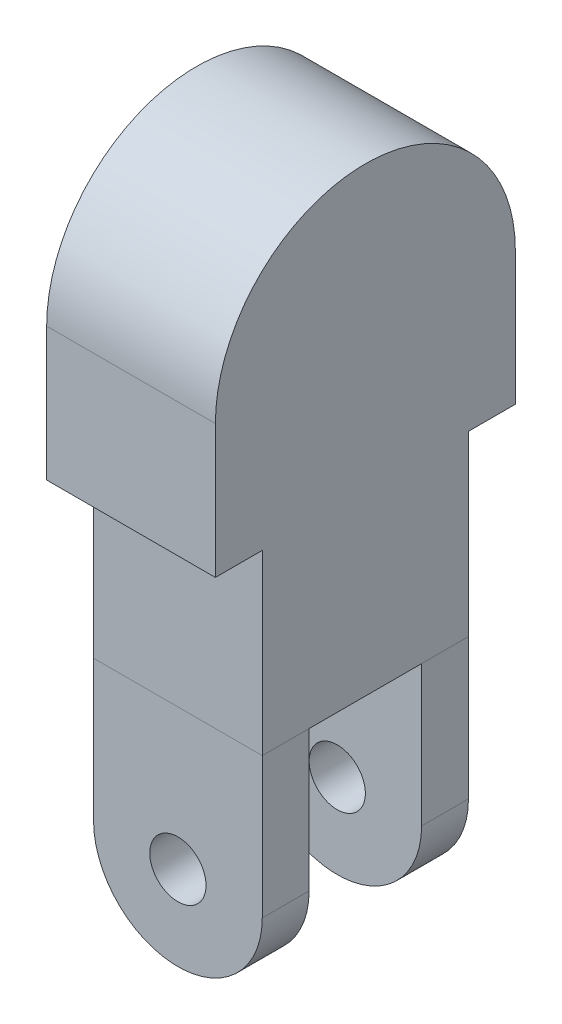
ISO-10303-21;
HEADER;
FILE_DESCRIPTION(('STEP AP214'),'2;1');
FILE_NAME('part.step','',(''),(''),'','','');
FILE_SCHEMA(('AUTOMOTIVE_DESIGN { 1 0 10303 214 1 1 1 1 }'));
ENDSEC;
DATA;
#1=APPLICATION_CONTEXT('core data for automotive mechanical design processes');
#2=APPLICATION_PROTOCOL_DEFINITION('international standard','automotive_design',2000,#1);
#3=PRODUCT_CONTEXT('',#1,'mechanical');
#4=PRODUCT('Part','Part','',(#3));
#5=PRODUCT_RELATED_PRODUCT_CATEGORY('part','',(#4));
#6=PRODUCT_DEFINITION_FORMATION('','',#4);
#7=PRODUCT_DEFINITION_CONTEXT('part definition',#1,'design');
#8=PRODUCT_DEFINITION('design','',#6,#7);
#9=PRODUCT_DEFINITION_SHAPE('','',#8);
#10=(LENGTH_UNIT() NAMED_UNIT(*) SI_UNIT(.MILLI.,.METRE.));
#11=(NAMED_UNIT(*) PLANE_ANGLE_UNIT() SI_UNIT($,.RADIAN.));
#12=(NAMED_UNIT(*) SI_UNIT($,.STERADIAN.) SOLID_ANGLE_UNIT());
#13=UNCERTAINTY_MEASURE_WITH_UNIT(LENGTH_MEASURE(1.E-05),#10,'distance_accuracy_value','');
#14=(GEOMETRIC_REPRESENTATION_CONTEXT(3) GLOBAL_UNCERTAINTY_ASSIGNED_CONTEXT((#13)) GLOBAL_UNIT_ASSIGNED_CONTEXT((#10,
#11,#12)) REPRESENTATION_CONTEXT('',''));
#15=CARTESIAN_POINT('',(0.,0.,0.));
#16=DIRECTION('',(0.,0.,1.));
#17=DIRECTION('',(1.,0.,0.));
#18=AXIS2_PLACEMENT_3D('',#15,#16,#17);
#19=CARTESIAN_POINT('',(4.5,16.98,0.));
#20=DIRECTION('',(1.,0.,0.));
#21=DIRECTION('',(0.,0.,-1.));
#22=AXIS2_PLACEMENT_3D('',#19,#20,#21);
#23=PLANE('',#22);
#24=CARTESIAN_POINT('',(4.5,24.09,-5.5));
#25=DIRECTION('',(1.,0.,0.));
#26=DIRECTION('',(0.,0.,-1.));
#27=AXIS2_PLACEMENT_3D('',#24,#25,#26);
#28=CIRCLE('',#27,8.);
#29=CARTESIAN_POINT('',(4.5,24.09,-13.5));
#30=VERTEX_POINT('',#29);
#31=CARTESIAN_POINT('',(4.5,24.09,2.5));
#32=VERTEX_POINT('',#31);
#33=EDGE_CURVE('E112',#30,#32,#28,.T.);
#34=ORIENTED_EDGE('',*,*,#33,.T.);
#35=DIRECTION('',(0.,-1.,0.));
#36=VECTOR('',#35,1.);
#37=CARTESIAN_POINT('',(4.5,24.09,2.5));
#38=LINE('',#37,#36);
#39=CARTESIAN_POINT('',(4.5,16.98,2.5));
#40=VERTEX_POINT('',#39);
#41=EDGE_CURVE('E139',#32,#40,#38,.T.);
#42=ORIENTED_EDGE('',*,*,#41,.T.);
#43=DIRECTION('',(0.,0.,1.));
#44=VECTOR('',#43,1.);
#45=CARTESIAN_POINT('',(4.5,16.98,0.));
#46=LINE('',#45,#44);
#47=CARTESIAN_POINT('',(4.5,16.98,0.));
#48=VERTEX_POINT('',#47);
#49=EDGE_CURVE('E148',#48,#40,#46,.T.);
#50=ORIENTED_EDGE('',*,*,#49,.F.);
#51=DIRECTION('',(0.,-1.,0.));
#52=VECTOR('',#51,1.);
#53=CARTESIAN_POINT('',(4.5,16.98,0.));
#54=LINE('',#53,#52);
#55=CARTESIAN_POINT('',(4.5,7.5,0.));
#56=VERTEX_POINT('',#55);
#57=EDGE_CURVE('E174',#48,#56,#54,.T.);
#58=ORIENTED_EDGE('',*,*,#57,.T.);
#59=DIRECTION('',(0.,0.,1.));
#60=VECTOR('',#59,1.);
#61=CARTESIAN_POINT('',(4.5,7.5,0.));
#62=LINE('',#61,#60);
#63=CARTESIAN_POINT('',(4.5,7.5,-11.));
#64=VERTEX_POINT('',#63);
#65=EDGE_CURVE('E163',#64,#56,#62,.T.);
#66=ORIENTED_EDGE('',*,*,#65,.F.);
#67=DIRECTION('',(0.,-1.,0.));
#68=VECTOR('',#67,1.);
#69=CARTESIAN_POINT('',(4.5,16.98,-11.));
#70=LINE('',#69,#68);
#71=CARTESIAN_POINT('',(4.5,16.98,-11.));
#72=VERTEX_POINT('',#71);
#73=EDGE_CURVE('E12',#72,#64,#70,.T.);
#74=ORIENTED_EDGE('',*,*,#73,.F.);
#75=CARTESIAN_POINT('',(4.5,16.98,-13.5));
#76=VERTEX_POINT('',#75);
#77=EDGE_CURVE('E124',#76,#72,#46,.T.);
#78=ORIENTED_EDGE('',*,*,#77,.F.);
#79=DIRECTION('',(0.,-1.,0.));
#80=VECTOR('',#79,1.);
#81=CARTESIAN_POINT('',(4.5,24.09,-13.5));
#82=LINE('',#81,#80);
#83=EDGE_CURVE('E120',#30,#76,#82,.T.);
#84=ORIENTED_EDGE('',*,*,#83,.F.);
#85=EDGE_LOOP('',(#34,#42,#50,#58,#66,#74,#78,#84));
#86=FACE_BOUND('',#85,.T.);
#87=ADVANCED_FACE('F52',(#86),#23,.T.);
#88=CARTESIAN_POINT('',(0.,16.98,-11.));
#89=DIRECTION('',(0.,0.,1.));
#90=DIRECTION('',(1.,0.,0.));
#91=AXIS2_PLACEMENT_3D('',#88,#89,#90);
#92=PLANE('',#91);
#93=DIRECTION('',(-1.,0.,0.));
#94=VECTOR('',#93,1.);
#95=CARTESIAN_POINT('',(0.,7.5,-11.));
#96=LINE('',#95,#94);
#97=CARTESIAN_POINT('',(-4.5,7.5,-11.));
#98=VERTEX_POINT('',#97);
#99=EDGE_CURVE('E178',#64,#98,#96,.T.);
#100=ORIENTED_EDGE('',*,*,#99,.T.);
#101=DIRECTION('',(0.,-1.,0.));
#102=VECTOR('',#101,1.);
#103=CARTESIAN_POINT('',(-4.5,16.98,-11.));
#104=LINE('',#103,#102);
#105=CARTESIAN_POINT('',(-4.5,16.98,-11.));
#106=VERTEX_POINT('',#105);
#107=EDGE_CURVE('E60',#106,#98,#104,.T.);
#108=ORIENTED_EDGE('',*,*,#107,.F.);
#109=DIRECTION('',(-1.,0.,0.));
#110=VECTOR('',#109,1.);
#111=CARTESIAN_POINT('',(0.,16.98,-11.));
#112=LINE('',#111,#110);
#113=EDGE_CURVE('E165',#72,#106,#112,.T.);
#114=ORIENTED_EDGE('',*,*,#113,.F.);
#115=ORIENTED_EDGE('',*,*,#73,.T.);
#116=EDGE_LOOP('',(#100,#108,#114,#115));
#117=FACE_BOUND('',#116,.T.);
#118=ADVANCED_FACE('F220',(#117),#92,.F.);
#119=CARTESIAN_POINT('',(-4.5,16.98,0.));
#120=DIRECTION('',(1.,0.,0.));
#121=DIRECTION('',(0.,0.,-1.));
#122=AXIS2_PLACEMENT_3D('',#119,#120,#121);
#123=PLANE('',#122);
#124=CARTESIAN_POINT('',(-4.5,24.09,-5.5));
#125=DIRECTION('',(1.,0.,0.));
#126=DIRECTION('',(0.,0.,-1.));
#127=AXIS2_PLACEMENT_3D('',#124,#125,#126);
#128=CIRCLE('',#127,8.);
#129=CARTESIAN_POINT('',(-4.5,24.09,-13.5));
#130=VERTEX_POINT('',#129);
#131=CARTESIAN_POINT('',(-4.5,24.09,2.5));
#132=VERTEX_POINT('',#131);
#133=EDGE_CURVE('E119',#130,#132,#128,.T.);
#134=ORIENTED_EDGE('',*,*,#133,.F.);
#135=DIRECTION('',(0.,-1.,0.));
#136=VECTOR('',#135,1.);
#137=CARTESIAN_POINT('',(-4.5,24.09,-13.5));
#138=LINE('',#137,#136);
#139=CARTESIAN_POINT('',(-4.5,16.98,-13.5));
#140=VERTEX_POINT('',#139);
#141=EDGE_CURVE('E129',#130,#140,#138,.T.);
#142=ORIENTED_EDGE('',*,*,#141,.T.);
#143=DIRECTION('',(0.,0.,-1.));
#144=VECTOR('',#143,1.);
#145=CARTESIAN_POINT('',(-4.5,16.98,0.));
#146=LINE('',#145,#144);
#147=EDGE_CURVE('E151',#106,#140,#146,.T.);
#148=ORIENTED_EDGE('',*,*,#147,.F.);
#149=ORIENTED_EDGE('',*,*,#107,.T.);
#150=DIRECTION('',(0.,0.,1.));
#151=VECTOR('',#150,1.);
#152=CARTESIAN_POINT('',(-4.5,7.5,0.));
#153=LINE('',#152,#151);
#154=CARTESIAN_POINT('',(-4.5,7.5,0.));
#155=VERTEX_POINT('',#154);
#156=EDGE_CURVE('E181',#98,#155,#153,.T.);
#157=ORIENTED_EDGE('',*,*,#156,.T.);
#158=DIRECTION('',(0.,-1.,0.));
#159=VECTOR('',#158,1.);
#160=CARTESIAN_POINT('',(-4.5,16.98,0.));
#161=LINE('',#160,#159);
#162=CARTESIAN_POINT('',(-4.5,16.98,0.));
#163=VERTEX_POINT('',#162);
#164=EDGE_CURVE('E190',#163,#155,#161,.T.);
#165=ORIENTED_EDGE('',*,*,#164,.F.);
#166=CARTESIAN_POINT('',(-4.5,16.98,2.5));
#167=VERTEX_POINT('',#166);
#168=EDGE_CURVE('E142',#167,#163,#146,.T.);
#169=ORIENTED_EDGE('',*,*,#168,.F.);
#170=DIRECTION('',(0.,-1.,0.));
#171=VECTOR('',#170,1.);
#172=CARTESIAN_POINT('',(-4.5,24.09,2.5));
#173=LINE('',#172,#171);
#174=EDGE_CURVE('E157',#132,#167,#173,.T.);
#175=ORIENTED_EDGE('',*,*,#174,.F.);
#176=EDGE_LOOP('',(#134,#142,#148,#149,#157,#165,#169,#175));
#177=FACE_BOUND('',#176,.T.);
#178=ADVANCED_FACE('F197',(#177),#123,.F.);
#179=CARTESIAN_POINT('',(0.,16.98,0.));
#180=DIRECTION('',(0.,0.,1.));
#181=DIRECTION('',(1.,0.,0.));
#182=AXIS2_PLACEMENT_3D('',#179,#180,#181);
#183=PLANE('',#182);
#184=DIRECTION('',(-1.,0.,0.));
#185=VECTOR('',#184,1.);
#186=CARTESIAN_POINT('',(0.,7.5,0.));
#187=LINE('',#186,#185);
#188=EDGE_CURVE('E170',#56,#155,#187,.T.);
#189=ORIENTED_EDGE('',*,*,#188,.F.);
#190=ORIENTED_EDGE('',*,*,#57,.F.);
#191=DIRECTION('',(-1.,0.,0.));
#192=VECTOR('',#191,1.);
#193=CARTESIAN_POINT('',(0.,16.98,0.));
#194=LINE('',#193,#192);
#195=EDGE_CURVE('E169',#48,#163,#194,.T.);
#196=ORIENTED_EDGE('',*,*,#195,.T.);
#197=ORIENTED_EDGE('',*,*,#164,.T.);
#198=EDGE_LOOP('',(#189,#190,#196,#197));
#199=FACE_BOUND('',#198,.T.);
#200=ADVANCED_FACE('F206',(#199),#183,.T.);
#201=CARTESIAN_POINT('',(0.,7.5,0.));
#202=DIRECTION('',(0.,1.,0.));
#203=DIRECTION('',(0.,0.,1.));
#204=AXIS2_PLACEMENT_3D('',#201,#202,#203);
#205=PLANE('',#204);
#206=ORIENTED_EDGE('',*,*,#65,.T.);
#207=ORIENTED_EDGE('',*,*,#188,.T.);
#208=ORIENTED_EDGE('',*,*,#156,.F.);
#209=ORIENTED_EDGE('',*,*,#99,.F.);
#210=EDGE_LOOP('',(#206,#207,#208,#209));
#211=FACE_BOUND('',#210,.T.);
#212=ADVANCED_FACE('F202',(#211),#205,.F.);
#213=CARTESIAN_POINT('',(-4.5,24.09,-5.5));
#214=DIRECTION('',(1.,0.,0.));
#215=DIRECTION('',(0.,0.,-1.));
#216=AXIS2_PLACEMENT_3D('',#213,#214,#215);
#217=CYLINDRICAL_SURFACE('',#216,8.);
#218=DIRECTION('',(1.,0.,0.));
#219=VECTOR('',#218,1.);
#220=CARTESIAN_POINT('',(0.,24.09,2.5));
#221=LINE('',#220,#219);
#222=EDGE_CURVE('E67',#132,#32,#221,.T.);
#223=ORIENTED_EDGE('',*,*,#222,.T.);
#224=ORIENTED_EDGE('',*,*,#33,.F.);
#225=DIRECTION('',(1.,0.,0.));
#226=VECTOR('',#225,1.);
#227=CARTESIAN_POINT('',(0.,24.09,-13.5));
#228=LINE('',#227,#226);
#229=EDGE_CURVE('E72',#130,#30,#228,.T.);
#230=ORIENTED_EDGE('',*,*,#229,.F.);
#231=ORIENTED_EDGE('',*,*,#133,.T.);
#232=EDGE_LOOP('',(#223,#224,#230,#231));
#233=FACE_BOUND('',#232,.T.);
#234=ADVANCED_FACE('F114',(#233),#217,.T.);
#235=CARTESIAN_POINT('',(0.,24.09,-13.5));
#236=DIRECTION('',(0.,0.,-1.));
#237=DIRECTION('',(-1.,0.,0.));
#238=AXIS2_PLACEMENT_3D('',#235,#236,#237);
#239=PLANE('',#238);
#240=DIRECTION('',(1.,0.,0.));
#241=VECTOR('',#240,1.);
#242=CARTESIAN_POINT('',(0.,16.98,-13.5));
#243=LINE('',#242,#241);
#244=EDGE_CURVE('E147',#140,#76,#243,.T.);
#245=ORIENTED_EDGE('',*,*,#244,.F.);
#246=ORIENTED_EDGE('',*,*,#141,.F.);
#247=ORIENTED_EDGE('',*,*,#229,.T.);
#248=ORIENTED_EDGE('',*,*,#83,.T.);
#249=EDGE_LOOP('',(#245,#246,#247,#248));
#250=FACE_BOUND('',#249,.T.);
#251=ADVANCED_FACE('F132',(#250),#239,.T.);
#252=CARTESIAN_POINT('',(0.,16.98,0.));
#253=DIRECTION('',(0.,1.,0.));
#254=DIRECTION('',(0.,0.,1.));
#255=AXIS2_PLACEMENT_3D('',#252,#253,#254);
#256=PLANE('',#255);
#257=ORIENTED_EDGE('',*,*,#77,.T.);
#258=ORIENTED_EDGE('',*,*,#113,.T.);
#259=ORIENTED_EDGE('',*,*,#147,.T.);
#260=ORIENTED_EDGE('',*,*,#244,.T.);
#261=EDGE_LOOP('',(#257,#258,#259,#260));
#262=FACE_BOUND('',#261,.T.);
#263=ADVANCED_FACE('F219',(#262),#256,.F.);
#264=ORIENTED_EDGE('',*,*,#195,.F.);
#265=ORIENTED_EDGE('',*,*,#49,.T.);
#266=DIRECTION('',(1.,0.,0.));
#267=VECTOR('',#266,1.);
#268=CARTESIAN_POINT('',(0.,16.98,2.5));
#269=LINE('',#268,#267);
#270=EDGE_CURVE('E135',#167,#40,#269,.T.);
#271=ORIENTED_EDGE('',*,*,#270,.F.);
#272=ORIENTED_EDGE('',*,*,#168,.T.);
#273=EDGE_LOOP('',(#264,#265,#271,#272));
#274=FACE_BOUND('',#273,.T.);
#275=ADVANCED_FACE('F212',(#274),#256,.F.);
#276=CARTESIAN_POINT('',(0.,24.09,2.5));
#277=DIRECTION('',(0.,0.,-1.));
#278=DIRECTION('',(-1.,0.,0.));
#279=AXIS2_PLACEMENT_3D('',#276,#277,#278);
#280=PLANE('',#279);
#281=ORIENTED_EDGE('',*,*,#270,.T.);
#282=ORIENTED_EDGE('',*,*,#41,.F.);
#283=ORIENTED_EDGE('',*,*,#222,.F.);
#284=ORIENTED_EDGE('',*,*,#174,.T.);
#285=EDGE_LOOP('',(#281,#282,#283,#284));
#286=FACE_BOUND('',#285,.T.);
#287=ADVANCED_FACE('F215',(#286),#280,.F.);
#288=CLOSED_SHELL('',(#87,#118,#178,#200,#212,#234,#251,#263,#275,#287));
#289=MANIFOLD_SOLID_BREP('B2',#288);
#290=CARTESIAN_POINT('',(0.,0.,-8.5));
#291=DIRECTION('',(0.,0.,-1.));
#292=DIRECTION('',(-1.,0.,0.));
#293=AXIS2_PLACEMENT_3D('',#290,#291,#292);
#294=CYLINDRICAL_SURFACE('',#293,4.5);
#295=CARTESIAN_POINT('',(0.,0.,-11.));
#296=DIRECTION('',(0.,0.,-1.));
#297=DIRECTION('',(-1.,0.,0.));
#298=AXIS2_PLACEMENT_3D('',#295,#296,#297);
#299=CIRCLE('',#298,4.5);
#300=CARTESIAN_POINT('',(4.5,0.,-11.));
#301=VERTEX_POINT('',#300);
#302=CARTESIAN_POINT('',(-4.5,0.,-11.));
#303=VERTEX_POINT('',#302);
#304=EDGE_CURVE('E429',#301,#303,#299,.T.);
#305=ORIENTED_EDGE('',*,*,#304,.F.);
#306=DIRECTION('',(0.,0.,-1.));
#307=VECTOR('',#306,1.);
#308=CARTESIAN_POINT('',(4.5,0.,-8.5));
#309=LINE('',#308,#307);
#310=CARTESIAN_POINT('',(4.5,0.,-8.5));
#311=VERTEX_POINT('',#310);
#312=EDGE_CURVE('E50',#311,#301,#309,.T.);
#313=ORIENTED_EDGE('',*,*,#312,.F.);
#314=CARTESIAN_POINT('',(0.,0.,-8.5));
#315=DIRECTION('',(0.,0.,-1.));
#316=DIRECTION('',(-1.,0.,0.));
#317=AXIS2_PLACEMENT_3D('',#314,#315,#316);
#318=CIRCLE('',#317,4.5);
#319=CARTESIAN_POINT('',(-4.5,0.,-8.5));
#320=VERTEX_POINT('',#319);
#321=EDGE_CURVE('E419',#311,#320,#318,.T.);
#322=ORIENTED_EDGE('',*,*,#321,.T.);
#323=DIRECTION('',(0.,0.,-1.));
#324=VECTOR('',#323,1.);
#325=CARTESIAN_POINT('',(-4.5,0.,-8.5));
#326=LINE('',#325,#324);
#327=EDGE_CURVE('E362',#320,#303,#326,.T.);
#328=ORIENTED_EDGE('',*,*,#327,.T.);
#329=EDGE_LOOP('',(#305,#313,#322,#328));
#330=FACE_BOUND('',#329,.T.);
#331=ADVANCED_FACE('F358',(#330),#294,.T.);
#332=CARTESIAN_POINT('',(4.5,0.,-8.5));
#333=DIRECTION('',(-1.,0.,0.));
#334=DIRECTION('',(0.,0.,1.));
#335=AXIS2_PLACEMENT_3D('',#332,#333,#334);
#336=PLANE('',#335);
#337=DIRECTION('',(0.,1.,0.));
#338=VECTOR('',#337,1.);
#339=CARTESIAN_POINT('',(4.5,0.,-11.));
#340=LINE('',#339,#338);
#341=CARTESIAN_POINT('',(4.5,7.5,-11.));
#342=VERTEX_POINT('',#341);
#343=EDGE_CURVE('E435',#301,#342,#340,.T.);
#344=ORIENTED_EDGE('',*,*,#343,.T.);
#345=DIRECTION('',(0.,0.,-1.));
#346=VECTOR('',#345,1.);
#347=CARTESIAN_POINT('',(4.5,7.5,-8.5));
#348=LINE('',#347,#346);
#349=CARTESIAN_POINT('',(4.5,7.5,-8.5));
#350=VERTEX_POINT('',#349);
#351=EDGE_CURVE('E368',#350,#342,#348,.T.);
#352=ORIENTED_EDGE('',*,*,#351,.F.);
#353=DIRECTION('',(0.,1.,0.));
#354=VECTOR('',#353,1.);
#355=CARTESIAN_POINT('',(4.5,0.,-8.5));
#356=LINE('',#355,#354);
#357=EDGE_CURVE('E412',#311,#350,#356,.T.);
#358=ORIENTED_EDGE('',*,*,#357,.F.);
#359=ORIENTED_EDGE('',*,*,#312,.T.);
#360=EDGE_LOOP('',(#344,#352,#358,#359));
#361=FACE_BOUND('',#360,.T.);
#362=ADVANCED_FACE('F437',(#361),#336,.F.);
#363=CARTESIAN_POINT('',(0.,7.5,-8.5));
#364=DIRECTION('',(0.,-1.,0.));
#365=DIRECTION('',(0.,0.,-1.));
#366=AXIS2_PLACEMENT_3D('',#363,#364,#365);
#367=PLANE('',#366);
#368=DIRECTION('',(-1.,0.,0.));
#369=VECTOR('',#368,1.);
#370=CARTESIAN_POINT('',(0.,7.5,-11.));
#371=LINE('',#370,#369);
#372=CARTESIAN_POINT('',(-4.5,7.5,-11.));
#373=VERTEX_POINT('',#372);
#374=EDGE_CURVE('E393',#342,#373,#371,.T.);
#375=ORIENTED_EDGE('',*,*,#374,.T.);
#376=DIRECTION('',(0.,0.,-1.));
#377=VECTOR('',#376,1.);
#378=CARTESIAN_POINT('',(-4.5,7.5,-8.5));
#379=LINE('',#378,#377);
#380=CARTESIAN_POINT('',(-4.5,7.5,-8.5));
#381=VERTEX_POINT('',#380);
#382=EDGE_CURVE('E416',#381,#373,#379,.T.);
#383=ORIENTED_EDGE('',*,*,#382,.F.);
#384=DIRECTION('',(-1.,0.,0.));
#385=VECTOR('',#384,1.);
#386=CARTESIAN_POINT('',(0.,7.5,-8.5));
#387=LINE('',#386,#385);
#388=EDGE_CURVE('E407',#350,#381,#387,.T.);
#389=ORIENTED_EDGE('',*,*,#388,.F.);
#390=ORIENTED_EDGE('',*,*,#351,.T.);
#391=EDGE_LOOP('',(#375,#383,#389,#390));
#392=FACE_BOUND('',#391,.T.);
#393=ADVANCED_FACE('F417',(#392),#367,.F.);
#394=CARTESIAN_POINT('',(0.,0.,-8.5));
#395=DIRECTION('',(0.,0.,-1.));
#396=DIRECTION('',(-1.,0.,0.));
#397=AXIS2_PLACEMENT_3D('',#394,#395,#396);
#398=CYLINDRICAL_SURFACE('',#397,1.5);
#399=CARTESIAN_POINT('',(0.,0.,-8.5));
#400=DIRECTION('',(0.,0.,-1.));
#401=DIRECTION('',(-1.,0.,0.));
#402=AXIS2_PLACEMENT_3D('',#399,#400,#401);
#403=CIRCLE('',#402,1.5);
#404=CARTESIAN_POINT('',(-1.5,0.,-8.5));
#405=VERTEX_POINT('',#404);
#406=EDGE_CURVE('E421',#405,#405,#403,.T.);
#407=ORIENTED_EDGE('',*,*,#406,.F.);
#408=EDGE_LOOP('',(#407));
#409=FACE_BOUND('',#408,.T.);
#410=CARTESIAN_POINT('',(0.,0.,-11.));
#411=DIRECTION('',(0.,0.,-1.));
#412=DIRECTION('',(-1.,0.,0.));
#413=AXIS2_PLACEMENT_3D('',#410,#411,#412);
#414=CIRCLE('',#413,1.5);
#415=CARTESIAN_POINT('',(-1.5,0.,-11.));
#416=VERTEX_POINT('',#415);
#417=EDGE_CURVE('E426',#416,#416,#414,.T.);
#418=ORIENTED_EDGE('',*,*,#417,.T.);
#419=EDGE_LOOP('',(#418));
#420=FACE_BOUND('',#419,.T.);
#421=ADVANCED_FACE('F360',(#409,#420),#398,.F.);
#422=CARTESIAN_POINT('',(-4.5,0.,-8.5));
#423=DIRECTION('',(-1.,0.,0.));
#424=DIRECTION('',(0.,0.,1.));
#425=AXIS2_PLACEMENT_3D('',#422,#423,#424);
#426=PLANE('',#425);
#427=DIRECTION('',(0.,1.,0.));
#428=VECTOR('',#427,1.);
#429=CARTESIAN_POINT('',(-4.5,0.,-11.));
#430=LINE('',#429,#428);
#431=EDGE_CURVE('E432',#303,#373,#430,.T.);
#432=ORIENTED_EDGE('',*,*,#431,.F.);
#433=ORIENTED_EDGE('',*,*,#327,.F.);
#434=DIRECTION('',(0.,1.,0.));
#435=VECTOR('',#434,1.);
#436=CARTESIAN_POINT('',(-4.5,0.,-8.5));
#437=LINE('',#436,#435);
#438=EDGE_CURVE('E411',#320,#381,#437,.T.);
#439=ORIENTED_EDGE('',*,*,#438,.T.);
#440=ORIENTED_EDGE('',*,*,#382,.T.);
#441=EDGE_LOOP('',(#432,#433,#439,#440));
#442=FACE_BOUND('',#441,.T.);
#443=ADVANCED_FACE('F418',(#442),#426,.T.);
#444=CARTESIAN_POINT('',(0.,0.,-8.5));
#445=DIRECTION('',(0.,0.,-1.));
#446=DIRECTION('',(-1.,0.,0.));
#447=AXIS2_PLACEMENT_3D('',#444,#445,#446);
#448=PLANE('',#447);
#449=ORIENTED_EDGE('',*,*,#406,.T.);
#450=EDGE_LOOP('',(#449));
#451=FACE_BOUND('',#450,.T.);
#452=ORIENTED_EDGE('',*,*,#321,.F.);
#453=ORIENTED_EDGE('',*,*,#357,.T.);
#454=ORIENTED_EDGE('',*,*,#388,.T.);
#455=ORIENTED_EDGE('',*,*,#438,.F.);
#456=EDGE_LOOP('',(#452,#453,#454,#455));
#457=FACE_BOUND('',#456,.T.);
#458=ADVANCED_FACE('F410',(#451,#457),#448,.F.);
#459=CARTESIAN_POINT('',(0.,0.,-11.));
#460=DIRECTION('',(0.,0.,-1.));
#461=DIRECTION('',(-1.,0.,0.));
#462=AXIS2_PLACEMENT_3D('',#459,#460,#461);
#463=PLANE('',#462);
#464=ORIENTED_EDGE('',*,*,#417,.F.);
#465=EDGE_LOOP('',(#464));
#466=FACE_BOUND('',#465,.T.);
#467=ORIENTED_EDGE('',*,*,#304,.T.);
#468=ORIENTED_EDGE('',*,*,#431,.T.);
#469=ORIENTED_EDGE('',*,*,#374,.F.);
#470=ORIENTED_EDGE('',*,*,#343,.F.);
#471=EDGE_LOOP('',(#467,#468,#469,#470));
#472=FACE_BOUND('',#471,.T.);
#473=ADVANCED_FACE('F438',(#466,#472),#463,.T.);
#474=CLOSED_SHELL('',(#331,#362,#393,#421,#443,#458,#473));
#475=MANIFOLD_SOLID_BREP('B6',#474);
#476=CARTESIAN_POINT('',(0.,0.,-2.5));
#477=DIRECTION('',(0.,0.,1.));
#478=DIRECTION('',(1.,0.,0.));
#479=AXIS2_PLACEMENT_3D('',#476,#477,#478);
#480=CYLINDRICAL_SURFACE('',#479,4.5);
#481=CARTESIAN_POINT('',(0.,0.,0.));
#482=DIRECTION('',(0.,0.,1.));
#483=DIRECTION('',(1.,0.,0.));
#484=AXIS2_PLACEMENT_3D('',#481,#482,#483);
#485=CIRCLE('',#484,4.5);
#486=CARTESIAN_POINT('',(-4.5,0.,0.));
#487=VERTEX_POINT('',#486);
#488=CARTESIAN_POINT('',(4.5,0.,0.));
#489=VERTEX_POINT('',#488);
#490=EDGE_CURVE('E580',#487,#489,#485,.T.);
#491=ORIENTED_EDGE('',*,*,#490,.F.);
#492=DIRECTION('',(0.,0.,1.));
#493=VECTOR('',#492,1.);
#494=CARTESIAN_POINT('',(-4.5,0.,-2.5));
#495=LINE('',#494,#493);
#496=CARTESIAN_POINT('',(-4.5,0.,-2.5));
#497=VERTEX_POINT('',#496);
#498=EDGE_CURVE('E356',#497,#487,#495,.T.);
#499=ORIENTED_EDGE('',*,*,#498,.F.);
#500=CARTESIAN_POINT('',(0.,0.,-2.5));
#501=DIRECTION('',(0.,0.,1.));
#502=DIRECTION('',(1.,0.,0.));
#503=AXIS2_PLACEMENT_3D('',#500,#501,#502);
#504=CIRCLE('',#503,4.5);
#505=CARTESIAN_POINT('',(4.5,0.,-2.5));
#506=VERTEX_POINT('',#505);
#507=EDGE_CURVE('E570',#497,#506,#504,.T.);
#508=ORIENTED_EDGE('',*,*,#507,.T.);
#509=DIRECTION('',(0.,0.,1.));
#510=VECTOR('',#509,1.);
#511=CARTESIAN_POINT('',(4.5,0.,-2.5));
#512=LINE('',#511,#510);
#513=EDGE_CURVE('E513',#506,#489,#512,.T.);
#514=ORIENTED_EDGE('',*,*,#513,.T.);
#515=EDGE_LOOP('',(#491,#499,#508,#514));
#516=FACE_BOUND('',#515,.T.);
#517=ADVANCED_FACE('F509',(#516),#480,.T.);
#518=CARTESIAN_POINT('',(-4.5,0.,-2.5));
#519=DIRECTION('',(1.,0.,0.));
#520=DIRECTION('',(0.,0.,-1.));
#521=AXIS2_PLACEMENT_3D('',#518,#519,#520);
#522=PLANE('',#521);
#523=DIRECTION('',(0.,1.,0.));
#524=VECTOR('',#523,1.);
#525=CARTESIAN_POINT('',(-4.5,0.,0.));
#526=LINE('',#525,#524);
#527=CARTESIAN_POINT('',(-4.5,7.5,0.));
#528=VERTEX_POINT('',#527);
#529=EDGE_CURVE('E586',#487,#528,#526,.T.);
#530=ORIENTED_EDGE('',*,*,#529,.T.);
#531=DIRECTION('',(0.,0.,1.));
#532=VECTOR('',#531,1.);
#533=CARTESIAN_POINT('',(-4.5,7.5,-2.5));
#534=LINE('',#533,#532);
#535=CARTESIAN_POINT('',(-4.5,7.5,-2.5));
#536=VERTEX_POINT('',#535);
#537=EDGE_CURVE('E519',#536,#528,#534,.T.);
#538=ORIENTED_EDGE('',*,*,#537,.F.);
#539=DIRECTION('',(0.,1.,0.));
#540=VECTOR('',#539,1.);
#541=CARTESIAN_POINT('',(-4.5,0.,-2.5));
#542=LINE('',#541,#540);
#543=EDGE_CURVE('E563',#497,#536,#542,.T.);
#544=ORIENTED_EDGE('',*,*,#543,.F.);
#545=ORIENTED_EDGE('',*,*,#498,.T.);
#546=EDGE_LOOP('',(#530,#538,#544,#545));
#547=FACE_BOUND('',#546,.T.);
#548=ADVANCED_FACE('F588',(#547),#522,.F.);
#549=CARTESIAN_POINT('',(0.,7.5,-2.5));
#550=DIRECTION('',(0.,-1.,0.));
#551=DIRECTION('',(0.,0.,-1.));
#552=AXIS2_PLACEMENT_3D('',#549,#550,#551);
#553=PLANE('',#552);
#554=DIRECTION('',(1.,0.,0.));
#555=VECTOR('',#554,1.);
#556=CARTESIAN_POINT('',(0.,7.5,0.));
#557=LINE('',#556,#555);
#558=CARTESIAN_POINT('',(4.5,7.5,0.));
#559=VERTEX_POINT('',#558);
#560=EDGE_CURVE('E544',#528,#559,#557,.T.);
#561=ORIENTED_EDGE('',*,*,#560,.T.);
#562=DIRECTION('',(0.,0.,1.));
#563=VECTOR('',#562,1.);
#564=CARTESIAN_POINT('',(4.5,7.5,-2.5));
#565=LINE('',#564,#563);
#566=CARTESIAN_POINT('',(4.5,7.5,-2.5));
#567=VERTEX_POINT('',#566);
#568=EDGE_CURVE('E567',#567,#559,#565,.T.);
#569=ORIENTED_EDGE('',*,*,#568,.F.);
#570=DIRECTION('',(1.,0.,0.));
#571=VECTOR('',#570,1.);
#572=CARTESIAN_POINT('',(0.,7.5,-2.5));
#573=LINE('',#572,#571);
#574=EDGE_CURVE('E558',#536,#567,#573,.T.);
#575=ORIENTED_EDGE('',*,*,#574,.F.);
#576=ORIENTED_EDGE('',*,*,#537,.T.);
#577=EDGE_LOOP('',(#561,#569,#575,#576));
#578=FACE_BOUND('',#577,.T.);
#579=ADVANCED_FACE('F568',(#578),#553,.F.);
#580=CARTESIAN_POINT('',(0.,0.,-2.5));
#581=DIRECTION('',(0.,0.,1.));
#582=DIRECTION('',(1.,0.,0.));
#583=AXIS2_PLACEMENT_3D('',#580,#581,#582);
#584=CYLINDRICAL_SURFACE('',#583,1.5);
#585=CARTESIAN_POINT('',(0.,0.,-2.5));
#586=DIRECTION('',(0.,0.,1.));
#587=DIRECTION('',(1.,0.,0.));
#588=AXIS2_PLACEMENT_3D('',#585,#586,#587);
#589=CIRCLE('',#588,1.5);
#590=CARTESIAN_POINT('',(1.5,0.,-2.5));
#591=VERTEX_POINT('',#590);
#592=EDGE_CURVE('E572',#591,#591,#589,.T.);
#593=ORIENTED_EDGE('',*,*,#592,.F.);
#594=EDGE_LOOP('',(#593));
#595=FACE_BOUND('',#594,.T.);
#596=CARTESIAN_POINT('',(0.,0.,0.));
#597=DIRECTION('',(0.,0.,1.));
#598=DIRECTION('',(1.,0.,0.));
#599=AXIS2_PLACEMENT_3D('',#596,#597,#598);
#600=CIRCLE('',#599,1.5);
#601=CARTESIAN_POINT('',(1.5,0.,0.));
#602=VERTEX_POINT('',#601);
#603=EDGE_CURVE('E577',#602,#602,#600,.T.);
#604=ORIENTED_EDGE('',*,*,#603,.T.);
#605=EDGE_LOOP('',(#604));
#606=FACE_BOUND('',#605,.T.);
#607=ADVANCED_FACE('F511',(#595,#606),#584,.F.);
#608=CARTESIAN_POINT('',(4.5,0.,-2.5));
#609=DIRECTION('',(1.,0.,0.));
#610=DIRECTION('',(0.,0.,-1.));
#611=AXIS2_PLACEMENT_3D('',#608,#609,#610);
#612=PLANE('',#611);
#613=DIRECTION('',(0.,1.,0.));
#614=VECTOR('',#613,1.);
#615=CARTESIAN_POINT('',(4.5,0.,0.));
#616=LINE('',#615,#614);
#617=EDGE_CURVE('E583',#489,#559,#616,.T.);
#618=ORIENTED_EDGE('',*,*,#617,.F.);
#619=ORIENTED_EDGE('',*,*,#513,.F.);
#620=DIRECTION('',(0.,1.,0.));
#621=VECTOR('',#620,1.);
#622=CARTESIAN_POINT('',(4.5,0.,-2.5));
#623=LINE('',#622,#621);
#624=EDGE_CURVE('E562',#506,#567,#623,.T.);
#625=ORIENTED_EDGE('',*,*,#624,.T.);
#626=ORIENTED_EDGE('',*,*,#568,.T.);
#627=EDGE_LOOP('',(#618,#619,#625,#626));
#628=FACE_BOUND('',#627,.T.);
#629=ADVANCED_FACE('F569',(#628),#612,.T.);
#630=CARTESIAN_POINT('',(0.,0.,-2.5));
#631=DIRECTION('',(0.,0.,1.));
#632=DIRECTION('',(1.,0.,0.));
#633=AXIS2_PLACEMENT_3D('',#630,#631,#632);
#634=PLANE('',#633);
#635=ORIENTED_EDGE('',*,*,#592,.T.);
#636=EDGE_LOOP('',(#635));
#637=FACE_BOUND('',#636,.T.);
#638=ORIENTED_EDGE('',*,*,#507,.F.);
#639=ORIENTED_EDGE('',*,*,#543,.T.);
#640=ORIENTED_EDGE('',*,*,#574,.T.);
#641=ORIENTED_EDGE('',*,*,#624,.F.);
#642=EDGE_LOOP('',(#638,#639,#640,#641));
#643=FACE_BOUND('',#642,.T.);
#644=ADVANCED_FACE('F561',(#637,#643),#634,.F.);
#645=CARTESIAN_POINT('',(0.,0.,0.));
#646=DIRECTION('',(0.,0.,1.));
#647=DIRECTION('',(1.,0.,0.));
#648=AXIS2_PLACEMENT_3D('',#645,#646,#647);
#649=PLANE('',#648);
#650=ORIENTED_EDGE('',*,*,#603,.F.);
#651=EDGE_LOOP('',(#650));
#652=FACE_BOUND('',#651,.T.);
#653=ORIENTED_EDGE('',*,*,#490,.T.);
#654=ORIENTED_EDGE('',*,*,#617,.T.);
#655=ORIENTED_EDGE('',*,*,#560,.F.);
#656=ORIENTED_EDGE('',*,*,#529,.F.);
#657=EDGE_LOOP('',(#653,#654,#655,#656));
#658=FACE_BOUND('',#657,.T.);
#659=ADVANCED_FACE('F589',(#652,#658),#649,.T.);
#660=CLOSED_SHELL('',(#517,#548,#579,#607,#629,#644,#659));
#661=MANIFOLD_SOLID_BREP('B44',#660);
#662=ADVANCED_BREP_SHAPE_REPRESENTATION('',(#18,#289,#475,#661),#14);
#663=SHAPE_DEFINITION_REPRESENTATION(#9,#662);
ENDSEC;
END-ISO-10303-21;
